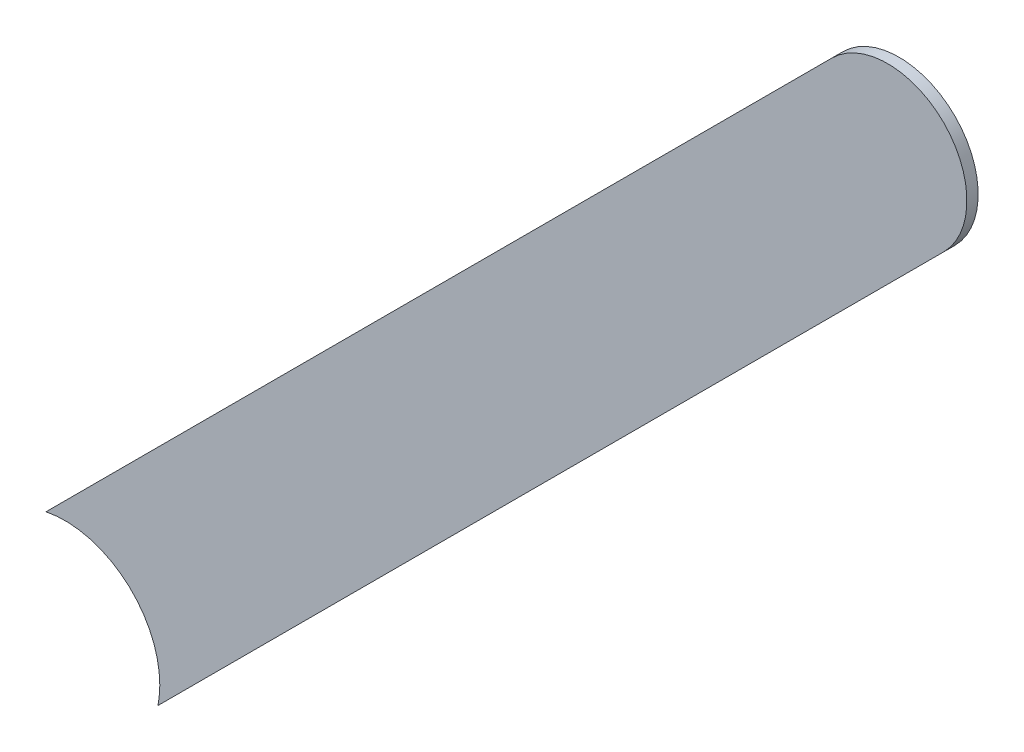
ISO-10303-21;
HEADER;
FILE_DESCRIPTION(('STEP AP214'),'2;1');
FILE_NAME('part.step','',(''),(''),'','','');
FILE_SCHEMA(('AUTOMOTIVE_DESIGN { 1 0 10303 214 1 1 1 1 }'));
ENDSEC;
DATA;
#1=APPLICATION_CONTEXT('core data for automotive mechanical design processes');
#2=APPLICATION_PROTOCOL_DEFINITION('international standard','automotive_design',2000,#1);
#3=PRODUCT_CONTEXT('',#1,'mechanical');
#4=PRODUCT('Part','Part','',(#3));
#5=PRODUCT_RELATED_PRODUCT_CATEGORY('part','',(#4));
#6=PRODUCT_DEFINITION_FORMATION('','',#4);
#7=PRODUCT_DEFINITION_CONTEXT('part definition',#1,'design');
#8=PRODUCT_DEFINITION('design','',#6,#7);
#9=PRODUCT_DEFINITION_SHAPE('','',#8);
#10=(LENGTH_UNIT() NAMED_UNIT(*) SI_UNIT(.MILLI.,.METRE.));
#11=(NAMED_UNIT(*) PLANE_ANGLE_UNIT() SI_UNIT($,.RADIAN.));
#12=(NAMED_UNIT(*) SI_UNIT($,.STERADIAN.) SOLID_ANGLE_UNIT());
#13=UNCERTAINTY_MEASURE_WITH_UNIT(LENGTH_MEASURE(1.E-05),#10,'distance_accuracy_value','');
#14=(GEOMETRIC_REPRESENTATION_CONTEXT(3) GLOBAL_UNCERTAINTY_ASSIGNED_CONTEXT((#13)) GLOBAL_UNIT_ASSIGNED_CONTEXT((#10,
#11,#12)) REPRESENTATION_CONTEXT('',''));
#15=CARTESIAN_POINT('',(0.,0.,0.));
#16=DIRECTION('',(0.,0.,1.));
#17=DIRECTION('',(1.,0.,0.));
#18=AXIS2_PLACEMENT_3D('',#15,#16,#17);
#19=CARTESIAN_POINT('',(106.4140172818,113.240485721801,0.));
#20=DIRECTION('',(-0.707106781186548,0.707106781186548,0.));
#21=DIRECTION('',(0.707106781186548,0.707106781186548,0.));
#22=AXIS2_PLACEMENT_3D('',#19,#20,#21);
#23=PLANE('',#22);
#24=DIRECTION('',(0.707106781186548,0.707106781186548,0.));
#25=VECTOR('',#24,1.);
#26=CARTESIAN_POINT('',(106.29675718,113.12322562,0.03556));
#27=LINE('',#26,#25);
#28=CARTESIAN_POINT('',(106.4140172818,113.240485721801,0.03556));
#29=VERTEX_POINT('',#28);
#30=CARTESIAN_POINT('',(108.89674944,115.72321788,0.03556));
#31=VERTEX_POINT('',#30);
#32=EDGE_CURVE('E11',#29,#31,#27,.T.);
#33=ORIENTED_EDGE('',*,*,#32,.F.);
#34=DIRECTION('',(0.,0.,1.));
#35=VECTOR('',#34,1.);
#36=CARTESIAN_POINT('',(106.4140172818,113.240485721801,0.));
#37=LINE('',#36,#35);
#38=CARTESIAN_POINT('',(106.4140172818,113.240485721801,0.));
#39=VERTEX_POINT('',#38);
#40=EDGE_CURVE('E24',#39,#29,#37,.T.);
#41=ORIENTED_EDGE('',*,*,#40,.F.);
#42=DIRECTION('',(0.707106781186548,0.707106781186548,0.));
#43=VECTOR('',#42,1.);
#44=CARTESIAN_POINT('',(106.29675718,113.12322562,0.));
#45=LINE('',#44,#43);
#46=CARTESIAN_POINT('',(108.89674944,115.72321788,0.));
#47=VERTEX_POINT('',#46);
#48=EDGE_CURVE('E82',#39,#47,#45,.T.);
#49=ORIENTED_EDGE('',*,*,#48,.T.);
#50=DIRECTION('',(0.,0.,1.));
#51=VECTOR('',#50,1.);
#52=CARTESIAN_POINT('',(108.89674944,115.72321788,0.));
#53=LINE('',#52,#51);
#54=EDGE_CURVE('E37',#47,#31,#53,.T.);
#55=ORIENTED_EDGE('',*,*,#54,.T.);
#56=EDGE_LOOP('',(#33,#41,#49,#55));
#57=FACE_BOUND('',#56,.T.);
#58=ADVANCED_FACE('F17',(#57),#23,.F.);
#59=CARTESIAN_POINT('',(108.71997306,115.89999426,0.));
#60=DIRECTION('',(0.,0.,-1.));
#61=DIRECTION('',(0.707106781186519,-0.707106781186576,0.));
#62=AXIS2_PLACEMENT_3D('',#59,#60,#61);
#63=CYLINDRICAL_SURFACE('',#62,0.24999955410322);
#64=CARTESIAN_POINT('',(108.71997306,115.89999426,0.03556));
#65=DIRECTION('',(0.,0.,1.));
#66=DIRECTION('',(0.707106781186519,-0.707106781186576,0.));
#67=AXIS2_PLACEMENT_3D('',#64,#65,#66);
#68=CIRCLE('',#67,0.24999955410322);
#69=CARTESIAN_POINT('',(108.54319668,116.07677064,0.03556));
#70=VERTEX_POINT('',#69);
#71=EDGE_CURVE('E97',#31,#70,#68,.T.);
#72=ORIENTED_EDGE('',*,*,#71,.F.);
#73=ORIENTED_EDGE('',*,*,#54,.F.);
#74=CARTESIAN_POINT('',(108.71997306,115.89999426,0.));
#75=DIRECTION('',(0.,0.,1.));
#76=DIRECTION('',(0.707106781186519,-0.707106781186576,0.));
#77=AXIS2_PLACEMENT_3D('',#74,#75,#76);
#78=CIRCLE('',#77,0.24999955410322);
#79=CARTESIAN_POINT('',(108.54319668,116.07677064,0.));
#80=VERTEX_POINT('',#79);
#81=EDGE_CURVE('E94',#47,#80,#78,.T.);
#82=ORIENTED_EDGE('',*,*,#81,.T.);
#83=DIRECTION('',(0.,0.,1.));
#84=VECTOR('',#83,1.);
#85=CARTESIAN_POINT('',(108.54319668,116.07677064,0.));
#86=LINE('',#85,#84);
#87=EDGE_CURVE('E92',#80,#70,#86,.T.);
#88=ORIENTED_EDGE('',*,*,#87,.T.);
#89=EDGE_LOOP('',(#72,#73,#82,#88));
#90=FACE_BOUND('',#89,.T.);
#91=ADVANCED_FACE('F103',(#90),#63,.T.);
#92=CARTESIAN_POINT('',(108.54319668,116.07677064,0.));
#93=DIRECTION('',(0.707106781186548,-0.707106781186548,0.));
#94=DIRECTION('',(-0.707106781186548,-0.707106781186548,0.));
#95=AXIS2_PLACEMENT_3D('',#92,#93,#94);
#96=PLANE('',#95);
#97=DIRECTION('',(-0.707106781186548,-0.707106781186548,0.));
#98=VECTOR('',#97,1.);
#99=CARTESIAN_POINT('',(108.54319668,116.07677064,0.03556));
#100=LINE('',#99,#98);
#101=CARTESIAN_POINT('',(106.060464521801,113.594038481801,0.03556));
#102=VERTEX_POINT('',#101);
#103=EDGE_CURVE('E89',#70,#102,#100,.T.);
#104=ORIENTED_EDGE('',*,*,#103,.F.);
#105=ORIENTED_EDGE('',*,*,#87,.F.);
#106=DIRECTION('',(-0.707106781186548,-0.707106781186548,0.));
#107=VECTOR('',#106,1.);
#108=CARTESIAN_POINT('',(108.54319668,116.07677064,0.));
#109=LINE('',#108,#107);
#110=CARTESIAN_POINT('',(106.060464521801,113.594038481801,0.));
#111=VERTEX_POINT('',#110);
#112=EDGE_CURVE('E87',#80,#111,#109,.T.);
#113=ORIENTED_EDGE('',*,*,#112,.T.);
#114=DIRECTION('',(0.,0.,1.));
#115=VECTOR('',#114,1.);
#116=CARTESIAN_POINT('',(106.060464521801,113.594038481801,0.));
#117=LINE('',#116,#115);
#118=EDGE_CURVE('E69',#111,#102,#117,.T.);
#119=ORIENTED_EDGE('',*,*,#118,.T.);
#120=EDGE_LOOP('',(#104,#105,#113,#119));
#121=FACE_BOUND('',#120,.T.);
#122=ADVANCED_FACE('F108',(#121),#96,.F.);
#123=CARTESIAN_POINT('',(106.1199808,113.300002,0.));
#124=DIRECTION('',(0.,0.,-1.));
#125=DIRECTION('',(1.,0.,0.));
#126=AXIS2_PLACEMENT_3D('',#123,#124,#125);
#127=CYLINDRICAL_SURFACE('',#126,0.2999994);
#128=DIRECTION('',(0.,0.,1.));
#129=VECTOR('',#128,1.);
#130=CARTESIAN_POINT('',(106.4199802,113.300002,0.));
#131=LINE('',#130,#129);
#132=CARTESIAN_POINT('',(106.4199802,113.300002,0.));
#133=VERTEX_POINT('',#132);
#134=CARTESIAN_POINT('',(106.4199802,113.300002,0.03556));
#135=VERTEX_POINT('',#134);
#136=EDGE_CURVE('E59',#133,#135,#131,.T.);
#137=ORIENTED_EDGE('',*,*,#136,.T.);
#138=CARTESIAN_POINT('',(106.1199808,113.300002,0.03556));
#139=DIRECTION('',(0.,0.,1.));
#140=DIRECTION('',(1.,0.,0.));
#141=AXIS2_PLACEMENT_3D('',#138,#139,#140);
#142=CIRCLE('',#141,0.2999994);
#143=EDGE_CURVE('E70',#135,#102,#142,.T.);
#144=ORIENTED_EDGE('',*,*,#143,.T.);
#145=ORIENTED_EDGE('',*,*,#118,.F.);
#146=CARTESIAN_POINT('',(106.1199808,113.300002,0.));
#147=DIRECTION('',(0.,0.,1.));
#148=DIRECTION('',(1.,0.,0.));
#149=AXIS2_PLACEMENT_3D('',#146,#147,#148);
#150=CIRCLE('',#149,0.2999994);
#151=EDGE_CURVE('E73',#133,#111,#150,.T.);
#152=ORIENTED_EDGE('',*,*,#151,.F.);
#153=EDGE_LOOP('',(#137,#144,#145,#152));
#154=FACE_BOUND('',#153,.T.);
#155=ADVANCED_FACE('F74',(#154),#127,.F.);
#156=CARTESIAN_POINT('',(106.1199808,113.300002,0.));
#157=DIRECTION('',(0.,0.,-1.));
#158=DIRECTION('',(1.,0.,0.));
#159=AXIS2_PLACEMENT_3D('',#156,#157,#158);
#160=CYLINDRICAL_SURFACE('',#159,0.2999994);
#161=ORIENTED_EDGE('',*,*,#40,.T.);
#162=CARTESIAN_POINT('',(106.1199808,113.300002,0.03556));
#163=DIRECTION('',(0.,0.,1.));
#164=DIRECTION('',(1.,0.,0.));
#165=AXIS2_PLACEMENT_3D('',#162,#163,#164);
#166=CIRCLE('',#165,0.2999994);
#167=EDGE_CURVE('E65',#29,#135,#166,.T.);
#168=ORIENTED_EDGE('',*,*,#167,.T.);
#169=ORIENTED_EDGE('',*,*,#136,.F.);
#170=EDGE_CURVE('E63',#39,#133,#150,.T.);
#171=ORIENTED_EDGE('',*,*,#170,.F.);
#172=EDGE_LOOP('',(#161,#168,#169,#171));
#173=FACE_BOUND('',#172,.T.);
#174=ADVANCED_FACE('F61',(#173),#160,.F.);
#175=CARTESIAN_POINT('',(106.29675718,113.12322562,0.));
#176=DIRECTION('',(0.,0.,-1.));
#177=DIRECTION('',(-1.,0.,0.));
#178=AXIS2_PLACEMENT_3D('',#175,#176,#177);
#179=PLANE('',#178);
#180=ORIENTED_EDGE('',*,*,#48,.F.);
#181=ORIENTED_EDGE('',*,*,#170,.T.);
#182=ORIENTED_EDGE('',*,*,#151,.T.);
#183=ORIENTED_EDGE('',*,*,#112,.F.);
#184=ORIENTED_EDGE('',*,*,#81,.F.);
#185=EDGE_LOOP('',(#180,#181,#182,#183,#184));
#186=FACE_BOUND('',#185,.T.);
#187=ADVANCED_FACE('F80',(#186),#179,.T.);
#188=CARTESIAN_POINT('',(106.29675718,113.12322562,0.03556));
#189=DIRECTION('',(0.,0.,-1.));
#190=DIRECTION('',(-1.,0.,0.));
#191=AXIS2_PLACEMENT_3D('',#188,#189,#190);
#192=PLANE('',#191);
#193=ORIENTED_EDGE('',*,*,#167,.F.);
#194=ORIENTED_EDGE('',*,*,#32,.T.);
#195=ORIENTED_EDGE('',*,*,#71,.T.);
#196=ORIENTED_EDGE('',*,*,#103,.T.);
#197=ORIENTED_EDGE('',*,*,#143,.F.);
#198=EDGE_LOOP('',(#193,#194,#195,#196,#197));
#199=FACE_BOUND('',#198,.T.);
#200=ADVANCED_FACE('F106',(#199),#192,.F.);
#201=CLOSED_SHELL('',(#58,#91,#122,#155,#174,#187,#200));
#202=MANIFOLD_SOLID_BREP('B1',#201);
#203=ADVANCED_BREP_SHAPE_REPRESENTATION('',(#18,#202),#14);
#204=SHAPE_DEFINITION_REPRESENTATION(#9,#203);
ENDSEC;
END-ISO-10303-21;
